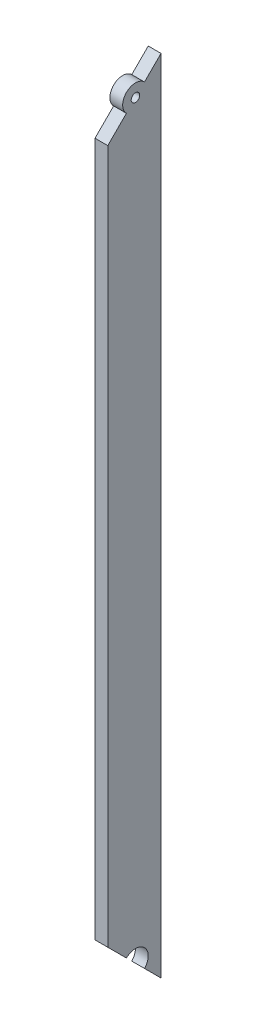
ISO-10303-21;
HEADER;
FILE_DESCRIPTION(('STEP AP214'),'2;1');
FILE_NAME('part.step','',(''),(''),'','','');
FILE_SCHEMA(('AUTOMOTIVE_DESIGN { 1 0 10303 214 1 1 1 1 }'));
ENDSEC;
DATA;
#1=APPLICATION_CONTEXT('core data for automotive mechanical design processes');
#2=APPLICATION_PROTOCOL_DEFINITION('international standard','automotive_design',2000,#1);
#3=PRODUCT_CONTEXT('',#1,'mechanical');
#4=PRODUCT('Part','Part','',(#3));
#5=PRODUCT_RELATED_PRODUCT_CATEGORY('part','',(#4));
#6=PRODUCT_DEFINITION_FORMATION('','',#4);
#7=PRODUCT_DEFINITION_CONTEXT('part definition',#1,'design');
#8=PRODUCT_DEFINITION('design','',#6,#7);
#9=PRODUCT_DEFINITION_SHAPE('','',#8);
#10=(LENGTH_UNIT() NAMED_UNIT(*) SI_UNIT(.MILLI.,.METRE.));
#11=(NAMED_UNIT(*) PLANE_ANGLE_UNIT() SI_UNIT($,.RADIAN.));
#12=(NAMED_UNIT(*) SI_UNIT($,.STERADIAN.) SOLID_ANGLE_UNIT());
#13=UNCERTAINTY_MEASURE_WITH_UNIT(LENGTH_MEASURE(1.E-05),#10,'distance_accuracy_value','');
#14=(GEOMETRIC_REPRESENTATION_CONTEXT(3) GLOBAL_UNCERTAINTY_ASSIGNED_CONTEXT((#13)) GLOBAL_UNIT_ASSIGNED_CONTEXT((#10,
#11,#12)) REPRESENTATION_CONTEXT('',''));
#15=CARTESIAN_POINT('',(0.,0.,0.));
#16=DIRECTION('',(0.,0.,1.));
#17=DIRECTION('',(1.,0.,0.));
#18=AXIS2_PLACEMENT_3D('',#15,#16,#17);
#19=CARTESIAN_POINT('',(6.,0.,0.));
#20=DIRECTION('',(0.,0.707106781186549,-0.707106781186546));
#21=DIRECTION('',(0.,0.707106781186546,0.707106781186549));
#22=AXIS2_PLACEMENT_3D('',#19,#20,#21);
#23=PLANE('',#22);
#24=DIRECTION('',(0.,-0.707106781186546,-0.707106781186549));
#25=VECTOR('',#24,1.);
#26=CARTESIAN_POINT('',(0.,0.,0.));
#27=LINE('',#26,#25);
#28=CARTESIAN_POINT('',(0.,24.9999999999999,25.));
#29=VERTEX_POINT('',#28);
#30=CARTESIAN_POINT('',(0.,16.2426406871222,16.2426406871223));
#31=VERTEX_POINT('',#30);
#32=EDGE_CURVE('E125',#29,#31,#27,.T.);
#33=ORIENTED_EDGE('',*,*,#32,.T.);
#34=DIRECTION('',(1.,0.,0.));
#35=VECTOR('',#34,1.);
#36=CARTESIAN_POINT('',(0.,16.2426406871222,16.2426406871223));
#37=LINE('',#36,#35);
#38=CARTESIAN_POINT('',(6.,16.2426406871222,16.2426406871223));
#39=VERTEX_POINT('',#38);
#40=EDGE_CURVE('E57',#31,#39,#37,.T.);
#41=ORIENTED_EDGE('',*,*,#40,.T.);
#42=DIRECTION('',(0.,-0.707106781186546,-0.707106781186549));
#43=VECTOR('',#42,1.);
#44=CARTESIAN_POINT('',(6.,0.,0.));
#45=LINE('',#44,#43);
#46=CARTESIAN_POINT('',(6.,24.9999999999999,25.));
#47=VERTEX_POINT('',#46);
#48=EDGE_CURVE('E144',#47,#39,#45,.T.);
#49=ORIENTED_EDGE('',*,*,#48,.F.);
#50=DIRECTION('',(-1.,0.,0.));
#51=VECTOR('',#50,1.);
#52=CARTESIAN_POINT('',(6.,24.9999999999999,25.));
#53=LINE('',#52,#51);
#54=EDGE_CURVE('E47',#47,#29,#53,.T.);
#55=ORIENTED_EDGE('',*,*,#54,.T.);
#56=EDGE_LOOP('',(#33,#41,#49,#55));
#57=FACE_BOUND('',#56,.T.);
#58=ADVANCED_FACE('F41',(#57),#23,.F.);
#59=CARTESIAN_POINT('',(6.,187.999999999998,188.));
#60=DIRECTION('',(0.,0.707106781186544,0.707106781186551));
#61=DIRECTION('',(0.,-0.707106781186551,0.707106781186544));
#62=AXIS2_PLACEMENT_3D('',#59,#60,#61);
#63=PLANE('',#62);
#64=DIRECTION('',(1.,0.,0.));
#65=VECTOR('',#64,1.);
#66=CARTESIAN_POINT('',(-16.9705627484771,359.75735931288,16.2426406871193));
#67=LINE('',#66,#65);
#68=CARTESIAN_POINT('',(0.,359.75735931288,16.2426406871193));
#69=VERTEX_POINT('',#68);
#70=CARTESIAN_POINT('',(6.,359.75735931288,16.2426406871193));
#71=VERTEX_POINT('',#70);
#72=EDGE_CURVE('E126',#69,#71,#67,.T.);
#73=ORIENTED_EDGE('',*,*,#72,.F.);
#74=DIRECTION('',(0.,0.707106781186552,-0.707106781186544));
#75=VECTOR('',#74,1.);
#76=CARTESIAN_POINT('',(0.,187.999999999998,188.));
#77=LINE('',#76,#75);
#78=CARTESIAN_POINT('',(0.,351.,25.));
#79=VERTEX_POINT('',#78);
#80=EDGE_CURVE('E135',#79,#69,#77,.T.);
#81=ORIENTED_EDGE('',*,*,#80,.F.);
#82=DIRECTION('',(-1.,0.,0.));
#83=VECTOR('',#82,1.);
#84=CARTESIAN_POINT('',(6.,351.,25.));
#85=LINE('',#84,#83);
#86=CARTESIAN_POINT('',(6.,351.,25.));
#87=VERTEX_POINT('',#86);
#88=EDGE_CURVE('E133',#87,#79,#85,.T.);
#89=ORIENTED_EDGE('',*,*,#88,.F.);
#90=DIRECTION('',(0.,0.707106781186552,-0.707106781186544));
#91=VECTOR('',#90,1.);
#92=CARTESIAN_POINT('',(6.,187.999999999998,188.));
#93=LINE('',#92,#91);
#94=EDGE_CURVE('E140',#87,#71,#93,.T.);
#95=ORIENTED_EDGE('',*,*,#94,.T.);
#96=EDGE_LOOP('',(#73,#81,#89,#95));
#97=FACE_BOUND('',#96,.T.);
#98=ADVANCED_FACE('F151',(#97),#63,.T.);
#99=CARTESIAN_POINT('',(6.,0.,25.));
#100=DIRECTION('',(0.,0.,1.));
#101=DIRECTION('',(1.,0.,0.));
#102=AXIS2_PLACEMENT_3D('',#99,#100,#101);
#103=PLANE('',#102);
#104=DIRECTION('',(0.,1.,0.));
#105=VECTOR('',#104,1.);
#106=CARTESIAN_POINT('',(0.,0.,25.));
#107=LINE('',#106,#105);
#108=EDGE_CURVE('E123',#29,#79,#107,.T.);
#109=ORIENTED_EDGE('',*,*,#108,.F.);
#110=ORIENTED_EDGE('',*,*,#54,.F.);
#111=DIRECTION('',(0.,1.,0.));
#112=VECTOR('',#111,1.);
#113=CARTESIAN_POINT('',(6.,0.,25.));
#114=LINE('',#113,#112);
#115=EDGE_CURVE('E131',#47,#87,#114,.T.);
#116=ORIENTED_EDGE('',*,*,#115,.T.);
#117=ORIENTED_EDGE('',*,*,#88,.T.);
#118=EDGE_LOOP('',(#109,#110,#116,#117));
#119=FACE_BOUND('',#118,.T.);
#120=ADVANCED_FACE('F43',(#119),#103,.T.);
#121=CARTESIAN_POINT('',(6.,7.75735931288367,7.7573593128837));
#122=VERTEX_POINT('',#121);
#123=CARTESIAN_POINT('',(6.,0.,0.));
#124=VERTEX_POINT('',#123);
#125=EDGE_CURVE('E112',#122,#124,#45,.T.);
#126=ORIENTED_EDGE('',*,*,#125,.F.);
#127=DIRECTION('',(1.,0.,0.));
#128=VECTOR('',#127,1.);
#129=CARTESIAN_POINT('',(0.,7.75735931288367,7.7573593128837));
#130=LINE('',#129,#128);
#131=CARTESIAN_POINT('',(0.,7.75735931288367,7.7573593128837));
#132=VERTEX_POINT('',#131);
#133=EDGE_CURVE('E105',#122,#132,#130,.F.);
#134=ORIENTED_EDGE('',*,*,#133,.T.);
#135=CARTESIAN_POINT('',(0.,0.,0.));
#136=VERTEX_POINT('',#135);
#137=EDGE_CURVE('E111',#132,#136,#27,.T.);
#138=ORIENTED_EDGE('',*,*,#137,.T.);
#139=DIRECTION('',(-1.,0.,0.));
#140=VECTOR('',#139,1.);
#141=CARTESIAN_POINT('',(6.,0.,0.));
#142=LINE('',#141,#140);
#143=EDGE_CURVE('E141',#124,#136,#142,.T.);
#144=ORIENTED_EDGE('',*,*,#143,.F.);
#145=EDGE_LOOP('',(#126,#134,#138,#144));
#146=FACE_BOUND('',#145,.T.);
#147=ADVANCED_FACE('F113',(#146),#23,.F.);
#148=CARTESIAN_POINT('',(6.,0.,0.));
#149=DIRECTION('',(0.,0.,-1.));
#150=DIRECTION('',(-1.,0.,0.));
#151=AXIS2_PLACEMENT_3D('',#148,#149,#150);
#152=PLANE('',#151);
#153=DIRECTION('',(0.,-1.,0.));
#154=VECTOR('',#153,1.);
#155=CARTESIAN_POINT('',(0.,0.,0.));
#156=LINE('',#155,#154);
#157=CARTESIAN_POINT('',(0.,376.,0.));
#158=VERTEX_POINT('',#157);
#159=EDGE_CURVE('E121',#158,#136,#156,.T.);
#160=ORIENTED_EDGE('',*,*,#159,.F.);
#161=DIRECTION('',(-1.,0.,0.));
#162=VECTOR('',#161,1.);
#163=CARTESIAN_POINT('',(6.,376.,0.));
#164=LINE('',#163,#162);
#165=CARTESIAN_POINT('',(6.,376.,0.));
#166=VERTEX_POINT('',#165);
#167=EDGE_CURVE('E136',#166,#158,#164,.T.);
#168=ORIENTED_EDGE('',*,*,#167,.F.);
#169=DIRECTION('',(0.,-1.,0.));
#170=VECTOR('',#169,1.);
#171=CARTESIAN_POINT('',(6.,0.,0.));
#172=LINE('',#171,#170);
#173=EDGE_CURVE('E162',#166,#124,#172,.T.);
#174=ORIENTED_EDGE('',*,*,#173,.T.);
#175=ORIENTED_EDGE('',*,*,#143,.T.);
#176=EDGE_LOOP('',(#160,#168,#174,#175));
#177=FACE_BOUND('',#176,.T.);
#178=ADVANCED_FACE('F179',(#177),#152,.T.);
#179=DIRECTION('',(1.,0.,0.));
#180=VECTOR('',#179,1.);
#181=CARTESIAN_POINT('',(-16.9705627484771,368.242640687119,7.75735931288075));
#182=LINE('',#181,#180);
#183=CARTESIAN_POINT('',(6.,368.242640687119,7.75735931288075));
#184=VERTEX_POINT('',#183);
#185=CARTESIAN_POINT('',(0.,368.242640687119,7.75735931288076));
#186=VERTEX_POINT('',#185);
#187=EDGE_CURVE('E156',#184,#186,#182,.F.);
#188=ORIENTED_EDGE('',*,*,#187,.F.);
#189=EDGE_CURVE('E170',#184,#166,#93,.T.);
#190=ORIENTED_EDGE('',*,*,#189,.T.);
#191=ORIENTED_EDGE('',*,*,#167,.T.);
#192=EDGE_CURVE('E132',#186,#158,#77,.T.);
#193=ORIENTED_EDGE('',*,*,#192,.F.);
#194=EDGE_LOOP('',(#188,#190,#191,#193));
#195=FACE_BOUND('',#194,.T.);
#196=ADVANCED_FACE('F175',(#195),#63,.T.);
#197=CARTESIAN_POINT('',(6.,0.,0.));
#198=DIRECTION('',(1.,0.,0.));
#199=DIRECTION('',(0.,0.,-1.));
#200=AXIS2_PLACEMENT_3D('',#197,#198,#199);
#201=PLANE('',#200);
#202=CARTESIAN_POINT('',(6.,364.,12.));
#203=DIRECTION('',(1.,0.,0.));
#204=DIRECTION('',(0.,0.,-1.));
#205=AXIS2_PLACEMENT_3D('',#202,#203,#204);
#206=CIRCLE('',#205,2.00000000000039);
#207=CARTESIAN_POINT('',(6.,364.,9.99999999999961));
#208=VERTEX_POINT('',#207);
#209=EDGE_CURVE('E176',#208,#208,#206,.T.);
#210=ORIENTED_EDGE('',*,*,#209,.F.);
#211=EDGE_LOOP('',(#210));
#212=FACE_BOUND('',#211,.T.);
#213=CARTESIAN_POINT('',(6.,12.,12.0000000000059));
#214=DIRECTION('',(1.,0.,0.));
#215=DIRECTION('',(0.,0.,-1.));
#216=AXIS2_PLACEMENT_3D('',#213,#214,#215);
#217=CIRCLE('',#216,6.);
#218=EDGE_CURVE('E180',#122,#39,#217,.T.);
#219=ORIENTED_EDGE('',*,*,#218,.F.);
#220=ORIENTED_EDGE('',*,*,#125,.T.);
#221=ORIENTED_EDGE('',*,*,#173,.F.);
#222=ORIENTED_EDGE('',*,*,#189,.F.);
#223=CARTESIAN_POINT('',(6.,364.,12.));
#224=DIRECTION('',(1.,0.,0.));
#225=DIRECTION('',(0.,0.,-1.));
#226=AXIS2_PLACEMENT_3D('',#223,#224,#225);
#227=CIRCLE('',#226,6.);
#228=EDGE_CURVE('E190',#184,#71,#227,.T.);
#229=ORIENTED_EDGE('',*,*,#228,.T.);
#230=ORIENTED_EDGE('',*,*,#94,.F.);
#231=ORIENTED_EDGE('',*,*,#115,.F.);
#232=ORIENTED_EDGE('',*,*,#48,.T.);
#233=EDGE_LOOP('',(#219,#220,#221,#222,#229,#230,#231,#232));
#234=FACE_BOUND('',#233,.T.);
#235=ADVANCED_FACE('F177',(#212,#234),#201,.T.);
#236=CARTESIAN_POINT('',(0.,0.,0.));
#237=DIRECTION('',(1.,0.,0.));
#238=DIRECTION('',(0.,0.,-1.));
#239=AXIS2_PLACEMENT_3D('',#236,#237,#238);
#240=PLANE('',#239);
#241=CARTESIAN_POINT('',(0.,364.,12.));
#242=DIRECTION('',(1.,0.,0.));
#243=DIRECTION('',(0.,0.,-1.));
#244=AXIS2_PLACEMENT_3D('',#241,#242,#243);
#245=CIRCLE('',#244,2.00000000000039);
#246=CARTESIAN_POINT('',(0.,364.,9.99999999999961));
#247=VERTEX_POINT('',#246);
#248=EDGE_CURVE('E116',#247,#247,#245,.T.);
#249=ORIENTED_EDGE('',*,*,#248,.T.);
#250=EDGE_LOOP('',(#249));
#251=FACE_BOUND('',#250,.T.);
#252=ORIENTED_EDGE('',*,*,#137,.F.);
#253=CARTESIAN_POINT('',(0.,12.,12.0000000000059));
#254=DIRECTION('',(1.,0.,0.));
#255=DIRECTION('',(0.,0.,-1.));
#256=AXIS2_PLACEMENT_3D('',#253,#254,#255);
#257=CIRCLE('',#256,6.);
#258=EDGE_CURVE('E11',#132,#31,#257,.T.);
#259=ORIENTED_EDGE('',*,*,#258,.T.);
#260=ORIENTED_EDGE('',*,*,#32,.F.);
#261=ORIENTED_EDGE('',*,*,#108,.T.);
#262=ORIENTED_EDGE('',*,*,#80,.T.);
#263=CARTESIAN_POINT('',(0.,364.,12.));
#264=DIRECTION('',(1.,0.,0.));
#265=DIRECTION('',(0.,0.,-1.));
#266=AXIS2_PLACEMENT_3D('',#263,#264,#265);
#267=CIRCLE('',#266,6.);
#268=EDGE_CURVE('E65',#69,#186,#267,.F.);
#269=ORIENTED_EDGE('',*,*,#268,.T.);
#270=ORIENTED_EDGE('',*,*,#192,.T.);
#271=ORIENTED_EDGE('',*,*,#159,.T.);
#272=EDGE_LOOP('',(#252,#259,#260,#261,#262,#269,#270,#271));
#273=FACE_BOUND('',#272,.T.);
#274=ADVANCED_FACE('F117',(#251,#273),#240,.F.);
#275=CARTESIAN_POINT('',(-16.9705627484771,364.,12.));
#276=DIRECTION('',(1.,0.,0.));
#277=DIRECTION('',(0.,0.,-1.));
#278=AXIS2_PLACEMENT_3D('',#275,#276,#277);
#279=CYLINDRICAL_SURFACE('',#278,6.);
#280=ORIENTED_EDGE('',*,*,#268,.F.);
#281=ORIENTED_EDGE('',*,*,#72,.T.);
#282=ORIENTED_EDGE('',*,*,#228,.F.);
#283=ORIENTED_EDGE('',*,*,#187,.T.);
#284=EDGE_LOOP('',(#280,#281,#282,#283));
#285=FACE_BOUND('',#284,.T.);
#286=ADVANCED_FACE('F186',(#285),#279,.T.);
#287=CARTESIAN_POINT('',(0.,12.,12.0000000000059));
#288=DIRECTION('',(1.,0.,0.));
#289=DIRECTION('',(0.,0.,-1.));
#290=AXIS2_PLACEMENT_3D('',#287,#288,#289);
#291=CYLINDRICAL_SURFACE('',#290,6.);
#292=ORIENTED_EDGE('',*,*,#258,.F.);
#293=ORIENTED_EDGE('',*,*,#133,.F.);
#294=ORIENTED_EDGE('',*,*,#218,.T.);
#295=ORIENTED_EDGE('',*,*,#40,.F.);
#296=EDGE_LOOP('',(#292,#293,#294,#295));
#297=FACE_BOUND('',#296,.T.);
#298=ADVANCED_FACE('F102',(#297),#291,.F.);
#299=CARTESIAN_POINT('',(0.,364.,12.));
#300=DIRECTION('',(1.,0.,0.));
#301=DIRECTION('',(0.,0.,-1.));
#302=AXIS2_PLACEMENT_3D('',#299,#300,#301);
#303=CYLINDRICAL_SURFACE('',#302,2.00000000000039);
#304=ORIENTED_EDGE('',*,*,#248,.F.);
#305=EDGE_LOOP('',(#304));
#306=FACE_BOUND('',#305,.T.);
#307=ORIENTED_EDGE('',*,*,#209,.T.);
#308=EDGE_LOOP('',(#307));
#309=FACE_BOUND('',#308,.T.);
#310=ADVANCED_FACE('F196',(#306,#309),#303,.F.);
#311=CLOSED_SHELL('',(#58,#98,#120,#147,#178,#196,#235,#274,#286,#298,#310));
#312=MANIFOLD_SOLID_BREP('B2',#311);
#313=ADVANCED_BREP_SHAPE_REPRESENTATION('',(#18,#312),#14);
#314=SHAPE_DEFINITION_REPRESENTATION(#9,#313);
ENDSEC;
END-ISO-10303-21;
